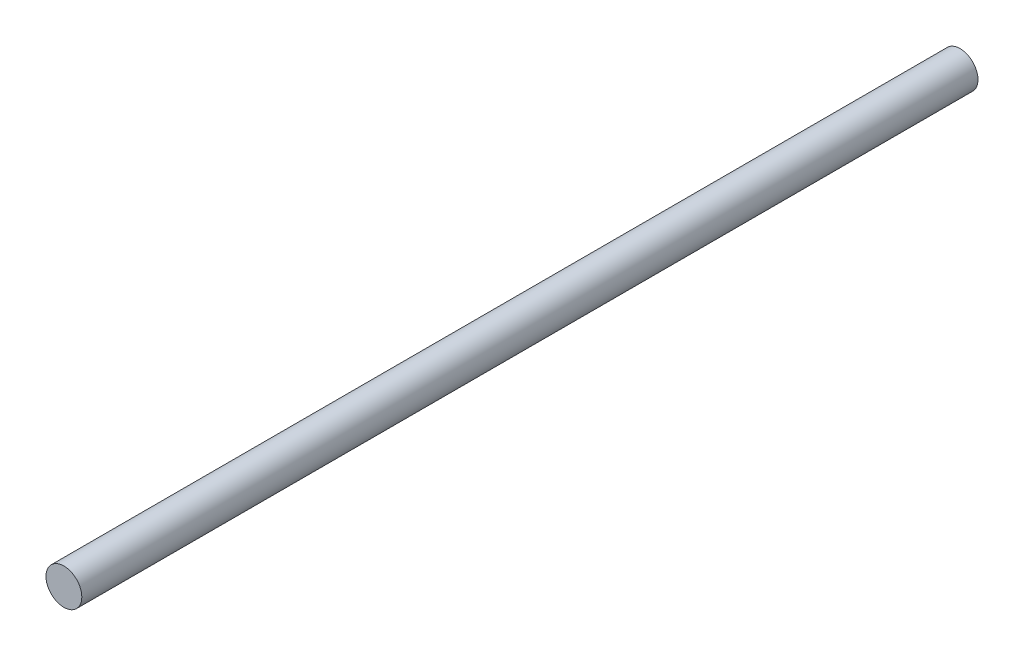
ISO-10303-21;
HEADER;
FILE_DESCRIPTION(('STEP AP214'),'2;1');
FILE_NAME('part.step','',(''),(''),'','','');
FILE_SCHEMA(('AUTOMOTIVE_DESIGN { 1 0 10303 214 1 1 1 1 }'));
ENDSEC;
DATA;
#1=APPLICATION_CONTEXT('core data for automotive mechanical design processes');
#2=APPLICATION_PROTOCOL_DEFINITION('international standard','automotive_design',2000,#1);
#3=PRODUCT_CONTEXT('',#1,'mechanical');
#4=PRODUCT('Part','Part','',(#3));
#5=PRODUCT_RELATED_PRODUCT_CATEGORY('part','',(#4));
#6=PRODUCT_DEFINITION_FORMATION('','',#4);
#7=PRODUCT_DEFINITION_CONTEXT('part definition',#1,'design');
#8=PRODUCT_DEFINITION('design','',#6,#7);
#9=PRODUCT_DEFINITION_SHAPE('','',#8);
#10=(LENGTH_UNIT() NAMED_UNIT(*) SI_UNIT(.MILLI.,.METRE.));
#11=(NAMED_UNIT(*) PLANE_ANGLE_UNIT() SI_UNIT($,.RADIAN.));
#12=(NAMED_UNIT(*) SI_UNIT($,.STERADIAN.) SOLID_ANGLE_UNIT());
#13=UNCERTAINTY_MEASURE_WITH_UNIT(LENGTH_MEASURE(1.E-05),#10,'distance_accuracy_value','');
#14=(GEOMETRIC_REPRESENTATION_CONTEXT(3) GLOBAL_UNCERTAINTY_ASSIGNED_CONTEXT((#13)) GLOBAL_UNIT_ASSIGNED_CONTEXT((#10,
#11,#12)) REPRESENTATION_CONTEXT('',''));
#15=CARTESIAN_POINT('',(0.,0.,0.));
#16=DIRECTION('',(0.,0.,1.));
#17=DIRECTION('',(1.,0.,0.));
#18=AXIS2_PLACEMENT_3D('',#15,#16,#17);
#19=CARTESIAN_POINT('',(0.,0.,150.));
#20=DIRECTION('',(0.,0.,-1.));
#21=DIRECTION('',(-1.,0.,0.));
#22=AXIS2_PLACEMENT_3D('',#19,#20,#21);
#23=CYLINDRICAL_SURFACE('',#22,3.);
#24=CARTESIAN_POINT('',(0.,0.,150.));
#25=DIRECTION('',(0.,0.,1.));
#26=DIRECTION('',(1.,0.,0.));
#27=AXIS2_PLACEMENT_3D('',#24,#25,#26);
#28=CIRCLE('',#27,3.);
#29=CARTESIAN_POINT('',(3.,0.,150.));
#30=VERTEX_POINT('',#29);
#31=EDGE_CURVE('E10',#30,#30,#28,.T.);
#32=ORIENTED_EDGE('',*,*,#31,.F.);
#33=EDGE_LOOP('',(#32));
#34=FACE_BOUND('',#33,.T.);
#35=CARTESIAN_POINT('',(0.,0.,0.));
#36=DIRECTION('',(0.,0.,1.));
#37=DIRECTION('',(1.,0.,0.));
#38=AXIS2_PLACEMENT_3D('',#35,#36,#37);
#39=CIRCLE('',#38,3.);
#40=CARTESIAN_POINT('',(3.,0.,0.));
#41=VERTEX_POINT('',#40);
#42=EDGE_CURVE('E35',#41,#41,#39,.T.);
#43=ORIENTED_EDGE('',*,*,#42,.T.);
#44=EDGE_LOOP('',(#43));
#45=FACE_BOUND('',#44,.T.);
#46=ADVANCED_FACE('F32',(#34,#45),#23,.T.);
#47=CARTESIAN_POINT('',(0.,0.,150.));
#48=DIRECTION('',(0.,0.,1.));
#49=DIRECTION('',(1.,0.,0.));
#50=AXIS2_PLACEMENT_3D('',#47,#48,#49);
#51=PLANE('',#50);
#52=ORIENTED_EDGE('',*,*,#31,.T.);
#53=EDGE_LOOP('',(#52));
#54=FACE_BOUND('',#53,.T.);
#55=ADVANCED_FACE('F47',(#54),#51,.T.);
#56=CARTESIAN_POINT('',(0.,0.,0.));
#57=DIRECTION('',(0.,0.,1.));
#58=DIRECTION('',(1.,0.,0.));
#59=AXIS2_PLACEMENT_3D('',#56,#57,#58);
#60=PLANE('',#59);
#61=ORIENTED_EDGE('',*,*,#42,.F.);
#62=EDGE_LOOP('',(#61));
#63=FACE_BOUND('',#62,.T.);
#64=ADVANCED_FACE('F45',(#63),#60,.F.);
#65=CLOSED_SHELL('',(#46,#55,#64));
#66=MANIFOLD_SOLID_BREP('B2',#65);
#67=ADVANCED_BREP_SHAPE_REPRESENTATION('',(#18,#66),#14);
#68=SHAPE_DEFINITION_REPRESENTATION(#9,#67);
ENDSEC;
END-ISO-10303-21;
